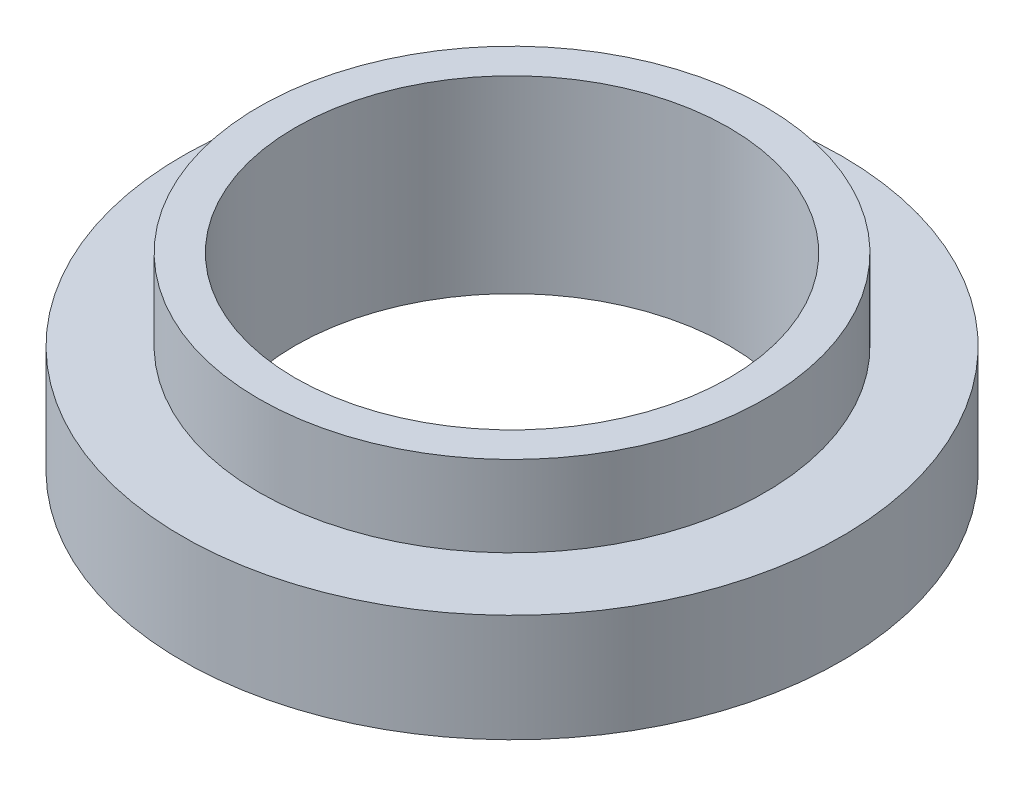
ISO-10303-21;
HEADER;
FILE_DESCRIPTION(('STEP AP214'),'2;1');
FILE_NAME('part.step','',(''),(''),'','','');
FILE_SCHEMA(('AUTOMOTIVE_DESIGN { 1 0 10303 214 1 1 1 1 }'));
ENDSEC;
DATA;
#1=APPLICATION_CONTEXT('core data for automotive mechanical design processes');
#2=APPLICATION_PROTOCOL_DEFINITION('international standard','automotive_design',2000,#1);
#3=PRODUCT_CONTEXT('',#1,'mechanical');
#4=PRODUCT('Part','Part','',(#3));
#5=PRODUCT_RELATED_PRODUCT_CATEGORY('part','',(#4));
#6=PRODUCT_DEFINITION_FORMATION('','',#4);
#7=PRODUCT_DEFINITION_CONTEXT('part definition',#1,'design');
#8=PRODUCT_DEFINITION('design','',#6,#7);
#9=PRODUCT_DEFINITION_SHAPE('','',#8);
#10=(LENGTH_UNIT() NAMED_UNIT(*) SI_UNIT(.MILLI.,.METRE.));
#11=(NAMED_UNIT(*) PLANE_ANGLE_UNIT() SI_UNIT($,.RADIAN.));
#12=(NAMED_UNIT(*) SI_UNIT($,.STERADIAN.) SOLID_ANGLE_UNIT());
#13=UNCERTAINTY_MEASURE_WITH_UNIT(LENGTH_MEASURE(1.E-05),#10,'distance_accuracy_value','');
#14=(GEOMETRIC_REPRESENTATION_CONTEXT(3) GLOBAL_UNCERTAINTY_ASSIGNED_CONTEXT((#13)) GLOBAL_UNIT_ASSIGNED_CONTEXT((#10,
#11,#12)) REPRESENTATION_CONTEXT('',''));
#15=CARTESIAN_POINT('',(0.,0.,0.));
#16=DIRECTION('',(0.,0.,1.));
#17=DIRECTION('',(1.,0.,0.));
#18=AXIS2_PLACEMENT_3D('',#15,#16,#17);
#19=CARTESIAN_POINT('',(0.,0.,0.));
#20=DIRECTION('',(0.,-1.,0.));
#21=DIRECTION('',(0.,0.,-1.));
#22=AXIS2_PLACEMENT_3D('',#19,#20,#21);
#23=CYLINDRICAL_SURFACE('',#22,37.17);
#24=CARTESIAN_POINT('',(0.,31.6666668532461,0.));
#25=DIRECTION('',(0.,-1.,0.));
#26=DIRECTION('',(0.,0.,-1.));
#27=AXIS2_PLACEMENT_3D('',#24,#25,#26);
#28=CIRCLE('',#27,37.17);
#29=CARTESIAN_POINT('',(0.,31.6666668532461,-37.17));
#30=VERTEX_POINT('',#29);
#31=EDGE_CURVE('E54',#30,#30,#28,.T.);
#32=ORIENTED_EDGE('',*,*,#31,.F.);
#33=EDGE_LOOP('',(#32));
#34=FACE_BOUND('',#33,.T.);
#35=CARTESIAN_POINT('',(0.,43.543777956722,0.));
#36=DIRECTION('',(0.,-1.,0.));
#37=DIRECTION('',(0.,0.,-1.));
#38=AXIS2_PLACEMENT_3D('',#35,#36,#37);
#39=CIRCLE('',#38,37.17);
#40=CARTESIAN_POINT('',(0.,43.543777956722,-37.17));
#41=VERTEX_POINT('',#40);
#42=EDGE_CURVE('E10',#41,#41,#39,.T.);
#43=ORIENTED_EDGE('',*,*,#42,.T.);
#44=EDGE_LOOP('',(#43));
#45=FACE_BOUND('',#44,.T.);
#46=ADVANCED_FACE('F32',(#34,#45),#23,.T.);
#47=CARTESIAN_POINT('',(-31.85,43.543777956722,0.));
#48=DIRECTION('',(0.,-1.,0.));
#49=DIRECTION('',(0.,0.,-1.));
#50=AXIS2_PLACEMENT_3D('',#47,#48,#49);
#51=PLANE('',#50);
#52=ORIENTED_EDGE('',*,*,#42,.F.);
#53=EDGE_LOOP('',(#52));
#54=FACE_BOUND('',#53,.T.);
#55=CARTESIAN_POINT('',(0.,43.543777956722,0.));
#56=DIRECTION('',(0.,-1.,0.));
#57=DIRECTION('',(0.,0.,-1.));
#58=AXIS2_PLACEMENT_3D('',#55,#56,#57);
#59=CIRCLE('',#58,31.85);
#60=CARTESIAN_POINT('',(0.,43.543777956722,-31.85));
#61=VERTEX_POINT('',#60);
#62=EDGE_CURVE('E38',#61,#61,#59,.T.);
#63=ORIENTED_EDGE('',*,*,#62,.T.);
#64=EDGE_LOOP('',(#63));
#65=FACE_BOUND('',#64,.T.);
#66=ADVANCED_FACE('F61',(#54,#65),#51,.F.);
#67=CARTESIAN_POINT('',(0.,0.,0.));
#68=DIRECTION('',(0.,-1.,0.));
#69=DIRECTION('',(0.,0.,-1.));
#70=AXIS2_PLACEMENT_3D('',#67,#68,#69);
#71=CYLINDRICAL_SURFACE('',#70,31.85);
#72=ORIENTED_EDGE('',*,*,#62,.F.);
#73=EDGE_LOOP('',(#72));
#74=FACE_BOUND('',#73,.T.);
#75=CARTESIAN_POINT('',(0.,15.8333335199128,0.));
#76=DIRECTION('',(0.,-1.,0.));
#77=DIRECTION('',(0.,0.,-1.));
#78=AXIS2_PLACEMENT_3D('',#75,#76,#77);
#79=CIRCLE('',#78,31.85);
#80=CARTESIAN_POINT('',(0.,15.8333335199128,-31.85));
#81=VERTEX_POINT('',#80);
#82=EDGE_CURVE('E42',#81,#81,#79,.T.);
#83=ORIENTED_EDGE('',*,*,#82,.T.);
#84=EDGE_LOOP('',(#83));
#85=FACE_BOUND('',#84,.T.);
#86=ADVANCED_FACE('F65',(#74,#85),#71,.F.);
#87=CARTESIAN_POINT('',(-40.7104405680304,15.8333335199128,0.));
#88=DIRECTION('',(0.,1.,0.));
#89=DIRECTION('',(0.,0.,1.));
#90=AXIS2_PLACEMENT_3D('',#87,#88,#89);
#91=PLANE('',#90);
#92=ORIENTED_EDGE('',*,*,#82,.F.);
#93=EDGE_LOOP('',(#92));
#94=FACE_BOUND('',#93,.T.);
#95=CARTESIAN_POINT('',(0.,15.8333335199128,0.));
#96=DIRECTION('',(0.,-1.,0.));
#97=DIRECTION('',(0.,0.,-1.));
#98=AXIS2_PLACEMENT_3D('',#95,#96,#97);
#99=CIRCLE('',#98,48.4);
#100=CARTESIAN_POINT('',(0.,15.8333335199128,-48.4));
#101=VERTEX_POINT('',#100);
#102=EDGE_CURVE('E46',#101,#101,#99,.T.);
#103=ORIENTED_EDGE('',*,*,#102,.T.);
#104=EDGE_LOOP('',(#103));
#105=FACE_BOUND('',#104,.T.);
#106=ADVANCED_FACE('F70',(#94,#105),#91,.F.);
#107=CARTESIAN_POINT('',(0.,0.,0.));
#108=DIRECTION('',(0.,-1.,0.));
#109=DIRECTION('',(0.,0.,-1.));
#110=AXIS2_PLACEMENT_3D('',#107,#108,#109);
#111=CYLINDRICAL_SURFACE('',#110,48.4);
#112=ORIENTED_EDGE('',*,*,#102,.F.);
#113=EDGE_LOOP('',(#112));
#114=FACE_BOUND('',#113,.T.);
#115=CARTESIAN_POINT('',(0.,31.6666668532461,0.));
#116=DIRECTION('',(0.,-1.,0.));
#117=DIRECTION('',(0.,0.,-1.));
#118=AXIS2_PLACEMENT_3D('',#115,#116,#117);
#119=CIRCLE('',#118,48.4);
#120=CARTESIAN_POINT('',(0.,31.6666668532461,-48.4));
#121=VERTEX_POINT('',#120);
#122=EDGE_CURVE('E51',#121,#121,#119,.T.);
#123=ORIENTED_EDGE('',*,*,#122,.T.);
#124=EDGE_LOOP('',(#123));
#125=FACE_BOUND('',#124,.T.);
#126=ADVANCED_FACE('F76',(#114,#125),#111,.T.);
#127=CARTESIAN_POINT('',(-37.17,31.6666668532461,0.));
#128=DIRECTION('',(0.,-1.,0.));
#129=DIRECTION('',(0.,0.,-1.));
#130=AXIS2_PLACEMENT_3D('',#127,#128,#129);
#131=PLANE('',#130);
#132=ORIENTED_EDGE('',*,*,#122,.F.);
#133=EDGE_LOOP('',(#132));
#134=FACE_BOUND('',#133,.T.);
#135=ORIENTED_EDGE('',*,*,#31,.T.);
#136=EDGE_LOOP('',(#135));
#137=FACE_BOUND('',#136,.T.);
#138=ADVANCED_FACE('F58',(#134,#137),#131,.F.);
#139=CLOSED_SHELL('',(#46,#66,#86,#106,#126,#138));
#140=MANIFOLD_SOLID_BREP('B2',#139);
#141=ADVANCED_BREP_SHAPE_REPRESENTATION('',(#18,#140),#14);
#142=SHAPE_DEFINITION_REPRESENTATION(#9,#141);
ENDSEC;
END-ISO-10303-21;
